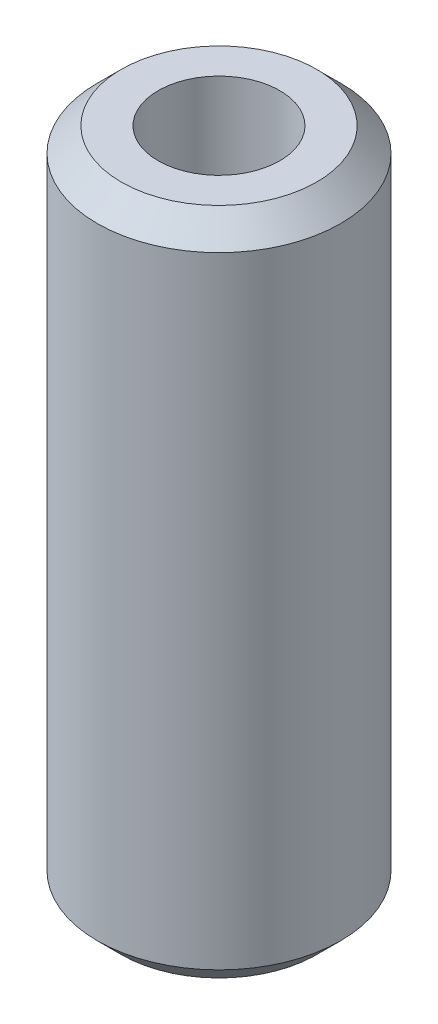
ISO-10303-21;
HEADER;
FILE_DESCRIPTION(('STEP AP214'),'2;1');
FILE_NAME('part.step','',(''),(''),'','','');
FILE_SCHEMA(('AUTOMOTIVE_DESIGN { 1 0 10303 214 1 1 1 1 }'));
ENDSEC;
DATA;
#1=APPLICATION_CONTEXT('core data for automotive mechanical design processes');
#2=APPLICATION_PROTOCOL_DEFINITION('international standard','automotive_design',2000,#1);
#3=PRODUCT_CONTEXT('',#1,'mechanical');
#4=PRODUCT('Part','Part','',(#3));
#5=PRODUCT_RELATED_PRODUCT_CATEGORY('part','',(#4));
#6=PRODUCT_DEFINITION_FORMATION('','',#4);
#7=PRODUCT_DEFINITION_CONTEXT('part definition',#1,'design');
#8=PRODUCT_DEFINITION('design','',#6,#7);
#9=PRODUCT_DEFINITION_SHAPE('','',#8);
#10=(LENGTH_UNIT() NAMED_UNIT(*) SI_UNIT(.MILLI.,.METRE.));
#11=(NAMED_UNIT(*) PLANE_ANGLE_UNIT() SI_UNIT($,.RADIAN.));
#12=(NAMED_UNIT(*) SI_UNIT($,.STERADIAN.) SOLID_ANGLE_UNIT());
#13=UNCERTAINTY_MEASURE_WITH_UNIT(LENGTH_MEASURE(1.E-05),#10,'distance_accuracy_value','');
#14=(GEOMETRIC_REPRESENTATION_CONTEXT(3) GLOBAL_UNCERTAINTY_ASSIGNED_CONTEXT((#13)) GLOBAL_UNIT_ASSIGNED_CONTEXT((#10,
#11,#12)) REPRESENTATION_CONTEXT('',''));
#15=CARTESIAN_POINT('',(0.,0.,0.));
#16=DIRECTION('',(0.,0.,1.));
#17=DIRECTION('',(1.,0.,0.));
#18=AXIS2_PLACEMENT_3D('',#15,#16,#17);
#19=CARTESIAN_POINT('',(0.,34.925,0.));
#20=DIRECTION('',(0.,1.,0.));
#21=DIRECTION('',(0.,0.,1.));
#22=AXIS2_PLACEMENT_3D('',#19,#20,#21);
#23=PLANE('',#22);
#24=CARTESIAN_POINT('',(0.,34.925,0.));
#25=DIRECTION('',(0.,1.,0.));
#26=DIRECTION('',(0.,0.,1.));
#27=AXIS2_PLACEMENT_3D('',#24,#25,#26);
#28=CIRCLE('',#27,10.2);
#29=CARTESIAN_POINT('',(0.,34.925,10.2));
#30=VERTEX_POINT('',#29);
#31=EDGE_CURVE('E10',#30,#30,#28,.T.);
#32=ORIENTED_EDGE('',*,*,#31,.T.);
#33=EDGE_LOOP('',(#32));
#34=FACE_BOUND('',#33,.T.);
#35=CARTESIAN_POINT('',(0.,34.925,0.));
#36=DIRECTION('',(0.,1.,0.));
#37=DIRECTION('',(0.,0.,1.));
#38=AXIS2_PLACEMENT_3D('',#35,#36,#37);
#39=CIRCLE('',#38,6.35);
#40=CARTESIAN_POINT('',(0.,34.925,6.35));
#41=VERTEX_POINT('',#40);
#42=EDGE_CURVE('E54',#41,#41,#39,.T.);
#43=ORIENTED_EDGE('',*,*,#42,.F.);
#44=EDGE_LOOP('',(#43));
#45=FACE_BOUND('',#44,.T.);
#46=ADVANCED_FACE('F33',(#34,#45),#23,.T.);
#47=CARTESIAN_POINT('',(0.,-34.925,0.));
#48=DIRECTION('',(0.,1.,0.));
#49=DIRECTION('',(0.,0.,1.));
#50=AXIS2_PLACEMENT_3D('',#47,#48,#49);
#51=PLANE('',#50);
#52=CARTESIAN_POINT('',(0.,-34.925,0.));
#53=DIRECTION('',(0.,1.,0.));
#54=DIRECTION('',(0.,0.,1.));
#55=AXIS2_PLACEMENT_3D('',#52,#53,#54);
#56=CIRCLE('',#55,10.2);
#57=CARTESIAN_POINT('',(0.,-34.925,10.2));
#58=VERTEX_POINT('',#57);
#59=EDGE_CURVE('E41',#58,#58,#56,.F.);
#60=ORIENTED_EDGE('',*,*,#59,.T.);
#61=EDGE_LOOP('',(#60));
#62=FACE_BOUND('',#61,.T.);
#63=CARTESIAN_POINT('',(0.,-34.925,0.));
#64=DIRECTION('',(0.,1.,0.));
#65=DIRECTION('',(0.,0.,1.));
#66=AXIS2_PLACEMENT_3D('',#63,#64,#65);
#67=CIRCLE('',#66,6.35);
#68=CARTESIAN_POINT('',(0.,-34.925,6.35));
#69=VERTEX_POINT('',#68);
#70=EDGE_CURVE('E55',#69,#69,#67,.T.);
#71=ORIENTED_EDGE('',*,*,#70,.T.);
#72=EDGE_LOOP('',(#71));
#73=FACE_BOUND('',#72,.T.);
#74=ADVANCED_FACE('F65',(#62,#73),#51,.F.);
#75=CARTESIAN_POINT('',(0.,34.925,0.));
#76=DIRECTION('',(0.,-1.,0.));
#77=DIRECTION('',(0.,0.,-1.));
#78=AXIS2_PLACEMENT_3D('',#75,#76,#77);
#79=CYLINDRICAL_SURFACE('',#78,12.7);
#80=CARTESIAN_POINT('',(0.,-32.425,0.));
#81=DIRECTION('',(0.,1.,0.));
#82=DIRECTION('',(0.,0.,1.));
#83=AXIS2_PLACEMENT_3D('',#80,#81,#82);
#84=CIRCLE('',#83,12.7);
#85=CARTESIAN_POINT('',(0.,-32.425,12.7));
#86=VERTEX_POINT('',#85);
#87=EDGE_CURVE('E45',#86,#86,#84,.T.);
#88=ORIENTED_EDGE('',*,*,#87,.T.);
#89=EDGE_LOOP('',(#88));
#90=FACE_BOUND('',#89,.T.);
#91=CARTESIAN_POINT('',(0.,32.425,0.));
#92=DIRECTION('',(0.,1.,0.));
#93=DIRECTION('',(0.,0.,1.));
#94=AXIS2_PLACEMENT_3D('',#91,#92,#93);
#95=CIRCLE('',#94,12.7);
#96=CARTESIAN_POINT('',(0.,32.425,12.7));
#97=VERTEX_POINT('',#96);
#98=EDGE_CURVE('E49',#97,#97,#95,.F.);
#99=ORIENTED_EDGE('',*,*,#98,.T.);
#100=EDGE_LOOP('',(#99));
#101=FACE_BOUND('',#100,.T.);
#102=ADVANCED_FACE('F70',(#90,#101),#79,.T.);
#103=CARTESIAN_POINT('',(0.,34.925,0.));
#104=DIRECTION('',(0.,-1.,0.));
#105=DIRECTION('',(0.,0.,-1.));
#106=AXIS2_PLACEMENT_3D('',#103,#104,#105);
#107=CYLINDRICAL_SURFACE('',#106,6.35);
#108=ORIENTED_EDGE('',*,*,#42,.T.);
#109=EDGE_LOOP('',(#108));
#110=FACE_BOUND('',#109,.T.);
#111=ORIENTED_EDGE('',*,*,#70,.F.);
#112=EDGE_LOOP('',(#111));
#113=FACE_BOUND('',#112,.T.);
#114=ADVANCED_FACE('F61',(#110,#113),#107,.F.);
#115=CARTESIAN_POINT('',(0.,-32.425,0.));
#116=DIRECTION('',(0.,1.,0.));
#117=DIRECTION('',(0.,0.,1.));
#118=AXIS2_PLACEMENT_3D('',#115,#116,#117);
#119=CONICAL_SURFACE('',#118,12.7,0.785398163397449);
#120=ORIENTED_EDGE('',*,*,#59,.F.);
#121=EDGE_LOOP('',(#120));
#122=FACE_BOUND('',#121,.T.);
#123=ORIENTED_EDGE('',*,*,#87,.F.);
#124=EDGE_LOOP('',(#123));
#125=FACE_BOUND('',#124,.T.);
#126=ADVANCED_FACE('F77',(#122,#125),#119,.T.);
#127=CARTESIAN_POINT('',(0.,34.925,0.));
#128=DIRECTION('',(0.,-1.,0.));
#129=DIRECTION('',(0.,0.,-1.));
#130=AXIS2_PLACEMENT_3D('',#127,#128,#129);
#131=CONICAL_SURFACE('',#130,10.2,0.785398163397446);
#132=ORIENTED_EDGE('',*,*,#98,.F.);
#133=EDGE_LOOP('',(#132));
#134=FACE_BOUND('',#133,.T.);
#135=ORIENTED_EDGE('',*,*,#31,.F.);
#136=EDGE_LOOP('',(#135));
#137=FACE_BOUND('',#136,.T.);
#138=ADVANCED_FACE('F36',(#134,#137),#131,.T.);
#139=CLOSED_SHELL('',(#46,#74,#102,#114,#126,#138));
#140=MANIFOLD_SOLID_BREP('B2',#139);
#141=ADVANCED_BREP_SHAPE_REPRESENTATION('',(#18,#140),#14);
#142=SHAPE_DEFINITION_REPRESENTATION(#9,#141);
ENDSEC;
END-ISO-10303-21;
